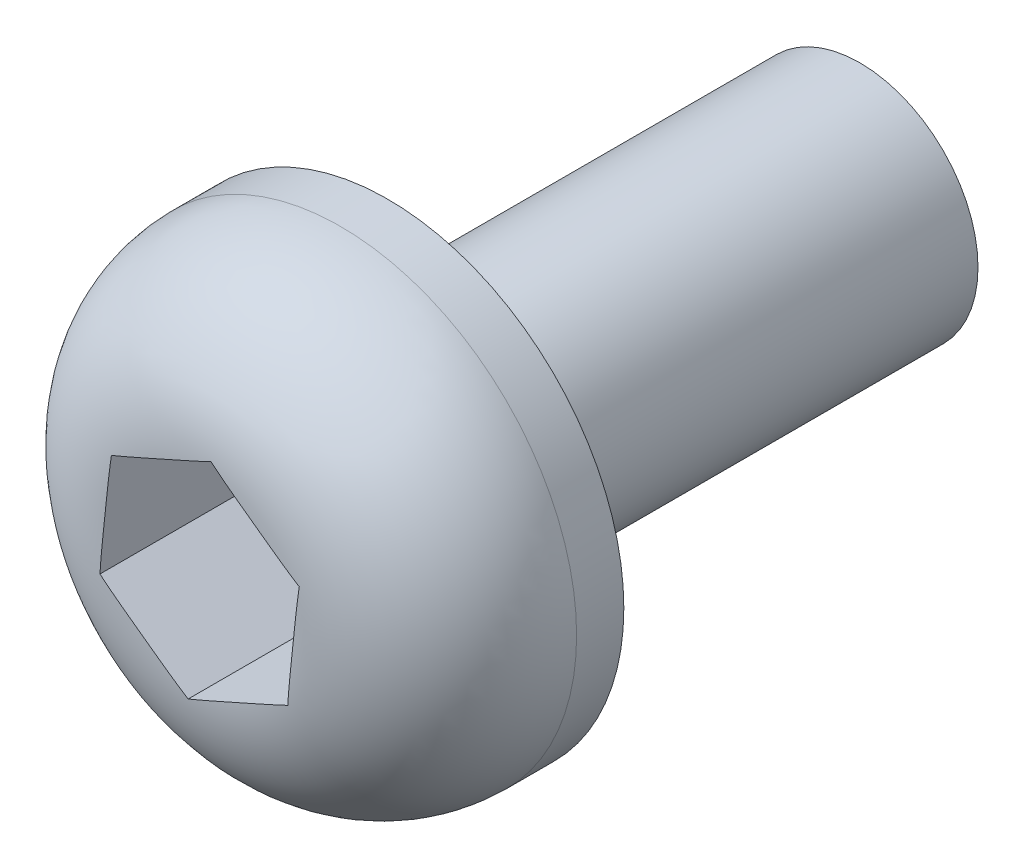
ISO-10303-21;
HEADER;
FILE_DESCRIPTION(('STEP AP214'),'2;1');
FILE_NAME('part.step','',(''),(''),'','','');
FILE_SCHEMA(('AUTOMOTIVE_DESIGN { 1 0 10303 214 1 1 1 1 }'));
ENDSEC;
DATA;
#1=APPLICATION_CONTEXT('core data for automotive mechanical design processes');
#2=APPLICATION_PROTOCOL_DEFINITION('international standard','automotive_design',2000,#1);
#3=PRODUCT_CONTEXT('',#1,'mechanical');
#4=PRODUCT('Part','Part','',(#3));
#5=PRODUCT_RELATED_PRODUCT_CATEGORY('part','',(#4));
#6=PRODUCT_DEFINITION_FORMATION('','',#4);
#7=PRODUCT_DEFINITION_CONTEXT('part definition',#1,'design');
#8=PRODUCT_DEFINITION('design','',#6,#7);
#9=PRODUCT_DEFINITION_SHAPE('','',#8);
#10=(LENGTH_UNIT() NAMED_UNIT(*) SI_UNIT(.MILLI.,.METRE.));
#11=(NAMED_UNIT(*) PLANE_ANGLE_UNIT() SI_UNIT($,.RADIAN.));
#12=(NAMED_UNIT(*) SI_UNIT($,.STERADIAN.) SOLID_ANGLE_UNIT());
#13=UNCERTAINTY_MEASURE_WITH_UNIT(LENGTH_MEASURE(1.E-05),#10,'distance_accuracy_value','');
#14=(GEOMETRIC_REPRESENTATION_CONTEXT(3) GLOBAL_UNCERTAINTY_ASSIGNED_CONTEXT((#13)) GLOBAL_UNIT_ASSIGNED_CONTEXT((#10,
#11,#12)) REPRESENTATION_CONTEXT('',''));
#15=CARTESIAN_POINT('',(0.,0.,0.));
#16=DIRECTION('',(0.,0.,1.));
#17=DIRECTION('',(1.,0.,0.));
#18=AXIS2_PLACEMENT_3D('',#15,#16,#17);
#19=CARTESIAN_POINT('',(0.,0.,10.));
#20=DIRECTION('',(0.,0.,-1.));
#21=DIRECTION('',(-1.,0.,0.));
#22=AXIS2_PLACEMENT_3D('',#19,#20,#21);
#23=CYLINDRICAL_SURFACE('',#22,2.5);
#24=CARTESIAN_POINT('',(0.,0.,10.));
#25=DIRECTION('',(0.,0.,1.));
#26=DIRECTION('',(1.,0.,0.));
#27=AXIS2_PLACEMENT_3D('',#24,#25,#26);
#28=CIRCLE('',#27,2.5);
#29=CARTESIAN_POINT('',(2.5,0.,10.));
#30=VERTEX_POINT('',#29);
#31=EDGE_CURVE('E156',#30,#30,#28,.T.);
#32=ORIENTED_EDGE('',*,*,#31,.F.);
#33=EDGE_LOOP('',(#32));
#34=FACE_BOUND('',#33,.T.);
#35=CARTESIAN_POINT('',(0.,0.,0.));
#36=DIRECTION('',(0.,0.,1.));
#37=DIRECTION('',(1.,0.,0.));
#38=AXIS2_PLACEMENT_3D('',#35,#36,#37);
#39=CIRCLE('',#38,2.5);
#40=CARTESIAN_POINT('',(2.5,0.,0.));
#41=VERTEX_POINT('',#40);
#42=EDGE_CURVE('E155',#41,#41,#39,.T.);
#43=ORIENTED_EDGE('',*,*,#42,.T.);
#44=EDGE_LOOP('',(#43));
#45=FACE_BOUND('',#44,.T.);
#46=ADVANCED_FACE('F39',(#34,#45),#23,.T.);
#47=CARTESIAN_POINT('',(0.,0.,0.));
#48=DIRECTION('',(0.,0.,1.));
#49=DIRECTION('',(1.,0.,0.));
#50=AXIS2_PLACEMENT_3D('',#47,#48,#49);
#51=PLANE('',#50);
#52=ORIENTED_EDGE('',*,*,#42,.F.);
#53=EDGE_LOOP('',(#52));
#54=FACE_BOUND('',#53,.T.);
#55=ADVANCED_FACE('F228',(#54),#51,.F.);
#56=CARTESIAN_POINT('',(0.,0.,14.));
#57=DIRECTION('',(0.,0.,-1.));
#58=DIRECTION('',(-1.,0.,0.));
#59=AXIS2_PLACEMENT_3D('',#56,#57,#58);
#60=CYLINDRICAL_SURFACE('',#59,5.);
#61=CARTESIAN_POINT('',(0.,0.,11.));
#62=DIRECTION('',(0.,0.,1.));
#63=DIRECTION('',(1.,0.,0.));
#64=AXIS2_PLACEMENT_3D('',#61,#62,#63);
#65=CIRCLE('',#64,5.);
#66=CARTESIAN_POINT('',(5.,0.,11.));
#67=VERTEX_POINT('',#66);
#68=EDGE_CURVE('E160',#67,#67,#65,.F.);
#69=ORIENTED_EDGE('',*,*,#68,.T.);
#70=EDGE_LOOP('',(#69));
#71=FACE_BOUND('',#70,.T.);
#72=CARTESIAN_POINT('',(0.,0.,10.));
#73=DIRECTION('',(0.,0.,1.));
#74=DIRECTION('',(1.,0.,0.));
#75=AXIS2_PLACEMENT_3D('',#72,#73,#74);
#76=CIRCLE('',#75,5.);
#77=CARTESIAN_POINT('',(5.,0.,10.));
#78=VERTEX_POINT('',#77);
#79=EDGE_CURVE('E137',#78,#78,#76,.T.);
#80=ORIENTED_EDGE('',*,*,#79,.T.);
#81=EDGE_LOOP('',(#80));
#82=FACE_BOUND('',#81,.T.);
#83=ADVANCED_FACE('F233',(#71,#82),#60,.T.);
#84=CARTESIAN_POINT('',(0.,0.,10.));
#85=DIRECTION('',(0.,0.,1.));
#86=DIRECTION('',(1.,0.,0.));
#87=AXIS2_PLACEMENT_3D('',#84,#85,#86);
#88=PLANE('',#87);
#89=ORIENTED_EDGE('',*,*,#31,.T.);
#90=EDGE_LOOP('',(#89));
#91=FACE_BOUND('',#90,.T.);
#92=ORIENTED_EDGE('',*,*,#79,.F.);
#93=EDGE_LOOP('',(#92));
#94=FACE_BOUND('',#93,.T.);
#95=ADVANCED_FACE('F192',(#91,#94),#88,.F.);
#96=CARTESIAN_POINT('',(0.,0.,11.));
#97=DIRECTION('',(0.,0.,1.));
#98=DIRECTION('',(1.,0.,0.));
#99=AXIS2_PLACEMENT_3D('',#96,#97,#98);
#100=DEGENERATE_TOROIDAL_SURFACE('',#99,2.,3.,.T.);
#101=CARTESIAN_POINT('',(0.242584408643206,2.2967350043414,13.9839911584187));
#102=CARTESIAN_POINT('',(0.154703364607828,2.25765305329027,13.9889633137289));
#103=CARTESIAN_POINT('',(0.0667727286874239,2.21854904802206,13.9923236986483));
#104=CARTESIAN_POINT('',(-0.109115845235615,2.14032889586108,13.9969215751443));
#105=CARTESIAN_POINT('',(-0.197073770320165,2.10121275471318,13.9981596148204));
#106=CARTESIAN_POINT('',(-0.3729708926868,2.02298880093767,13.999614716996));
#107=CARTESIAN_POINT('',(-0.460910089775323,1.98388098839614,13.9998320069029));
#108=CARTESIAN_POINT('',(-0.636795727842565,1.90566214185203,14.0000246574946));
#109=CARTESIAN_POINT('',(-0.724742168869094,1.86655110782817,14.));
#110=CARTESIAN_POINT('',(-0.900635050922154,1.78832903978046,14.));
#111=CARTESIAN_POINT('',(-0.988581491948683,1.7492180057566,14.0000246574946));
#112=CARTESIAN_POINT('',(-1.16446713001593,1.67099915921248,13.9998320069029));
#113=CARTESIAN_POINT('',(-1.25240632710445,1.63189134667096,13.999614716996));
#114=CARTESIAN_POINT('',(-1.42830344947108,1.55366739289545,13.9981596148204));
#115=CARTESIAN_POINT('',(-1.51626137455563,1.51455125174755,13.9969215751443));
#116=CARTESIAN_POINT('',(-1.69214994847867,1.43633109958657,13.9923236986483));
#117=CARTESIAN_POINT('',(-1.78008058439908,1.39722709431836,13.9889633137289));
#118=CARTESIAN_POINT('',(-1.86796162843445,1.35814514326723,13.9839911584187));
#119=B_SPLINE_CURVE_WITH_KNOTS('',3,(#101,#102,#103,#104,#105,#106,#107,#108,#109,#110,#111,
#112,#113,#114,#115,#116,#117,#118),.UNSPECIFIED.,.F.,.F.,(4,2,2,2,2,2,2,2,4),(0.,
0.288869834346141,0.577665056307041,0.866395936102187,1.15514851059254,1.44390108508289,
1.73263196487804,2.02142718683894,2.31029702118508),.UNSPECIFIED.);
#120=CARTESIAN_POINT('',(0.242384408643206,2.2966460614949,13.9840025089961));
#121=VERTEX_POINT('',#120);
#122=CARTESIAN_POINT('',(-1.86776162843445,1.35823408611373,13.9840025089971));
#123=VERTEX_POINT('',#122);
#124=EDGE_CURVE('E11',#121,#123,#119,.T.);
#125=ORIENTED_EDGE('',*,*,#124,.F.);
#126=CARTESIAN_POINT('',(2.11034603707766,0.938266535613536,13.9839896850081));
#127=CARTESIAN_POINT('',(2.03255764621417,0.994834163069987,13.9889622866953));
#128=CARTESIAN_POINT('',(1.95472535309896,1.05143371619287,13.9923229782809));
#129=CARTESIAN_POINT('',(1.79903659712337,1.16465039864926,13.9969212796634));
#130=CARTESIAN_POINT('',(1.72118014570051,1.22126751966541,13.9981594376807));
#131=CARTESIAN_POINT('',(1.56548382198476,1.33448970537365,13.9996146793568));
#132=CARTESIAN_POINT('',(1.48764394986328,1.39109476994109,13.9998319904746));
#133=CARTESIAN_POINT('',(1.33195779280956,1.50430956246452,14.000024659888));
#134=CARTESIAN_POINT('',(1.254111507835,1.56091929045127,14.));
#135=CARTESIAN_POINT('',(1.09841893788587,1.67413874642479,14.));
#136=CARTESIAN_POINT('',(1.0205726529113,1.73074847441154,14.000024659888));
#137=CARTESIAN_POINT('',(0.864886495857587,1.84396326693497,13.9998319904746));
#138=CARTESIAN_POINT('',(0.787046623736103,1.90056833150241,13.9996146793568));
#139=CARTESIAN_POINT('',(0.631350300020358,2.01379051721065,13.9981594376807));
#140=CARTESIAN_POINT('',(0.553493848597496,2.0704076382268,13.9969212796634));
#141=CARTESIAN_POINT('',(0.397805092621903,2.18362432068319,13.9923229782809));
#142=CARTESIAN_POINT('',(0.319972799506699,2.24022387380607,13.9889622866953));
#143=CARTESIAN_POINT('',(0.242184408643207,2.29679150126252,13.9839896850081));
#144=B_SPLINE_CURVE_WITH_KNOTS('',3,(#126,#127,#128,#129,#130,#131,#132,#133,#134,#135,#136,
#137,#138,#139,#140,#141,#142,#143),.UNSPECIFIED.,.F.,.F.,(4,2,2,2,2,2,2,2,4),(0.,
0.288876957701659,0.577679291323928,0.866417272664796,1.15517695212669,1.44393663158859,
1.73267461292945,2.02147694655172,2.31035390425338),.UNSPECIFIED.);
#145=CARTESIAN_POINT('',(2.11014603707766,0.938411975381164,13.9840025089971));
#146=VERTEX_POINT('',#145);
#147=EDGE_CURVE('E200',#146,#121,#144,.T.);
#148=ORIENTED_EDGE('',*,*,#147,.F.);
#149=CARTESIAN_POINT('',(1.86774052074941,-1.35843408611373,13.9839920803583));
#150=CARTESIAN_POINT('',(1.87783492551686,-1.2627873608063,13.9889639563617));
#151=CARTESIAN_POINT('',(1.88793502616267,-1.16708666578738,13.9923241493943));
#152=CARTESIAN_POINT('',(1.90813836323572,-0.975655563524609,13.9969217600313));
#153=CARTESIAN_POINT('',(1.91824159817938,-0.879925170338057,13.9981597256593));
#154=CARTESIAN_POINT('',(1.93844591708011,-0.688484765040082,13.9996147405474));
#155=CARTESIAN_POINT('',(1.94854700101497,-0.592774753139277,13.9998320171823));
#156=CARTESIAN_POINT('',(1.96875000088157,-0.401346845982427,14.000024655997));
#157=CARTESIAN_POINT('',(1.97885191681882,-0.305628950674356,14.));
#158=CARTESIAN_POINT('',(1.9990557486933,-0.114193160058213,14.));
#159=CARTESIAN_POINT('',(2.00915766463054,-0.018475264750141,14.000024655997));
#160=CARTESIAN_POINT('',(2.02936066449715,0.172952642406708,13.9998320171823));
#161=CARTESIAN_POINT('',(2.039461748432,0.268662654307513,13.9996147405474));
#162=CARTESIAN_POINT('',(2.05966606733274,0.460103059605488,13.9981597256593));
#163=CARTESIAN_POINT('',(2.06976930227639,0.55583345279204,13.9969217600313));
#164=CARTESIAN_POINT('',(2.08997263934944,0.747264555054807,13.9923241493943));
#165=CARTESIAN_POINT('',(2.10007273999526,0.842965250073737,13.9889639563617));
#166=CARTESIAN_POINT('',(2.11016714476271,0.938611975381164,13.9839920803583));
#167=B_SPLINE_CURVE_WITH_KNOTS('',3,(#149,#150,#151,#152,#153,#154,#155,#156,#157,#158,#159,
#160,#161,#162,#163,#164,#165,#166),.UNSPECIFIED.,.F.,.F.,(4,2,2,2,2,2,2,2,4),(0.,
0.288865376900354,0.577656148732329,0.866382584727764,1.15513071327492,1.44387884182207,
1.73260527781751,2.02139604964948,2.31026142654984),.UNSPECIFIED.);
#168=CARTESIAN_POINT('',(1.86776162843445,-1.35823408611373,13.984002508998));
#169=VERTEX_POINT('',#168);
#170=EDGE_CURVE('E175',#169,#146,#167,.T.);
#171=ORIENTED_EDGE('',*,*,#170,.F.);
#172=CARTESIAN_POINT('',(-0.242584408643206,-2.2967350043414,13.9839911584187));
#173=CARTESIAN_POINT('',(-0.154703364607828,-2.25765305329027,13.9889633137289));
#174=CARTESIAN_POINT('',(-0.0667727286874238,-2.21854904802206,13.9923236986483));
#175=CARTESIAN_POINT('',(0.109115845235615,-2.14032889586108,13.9969215751443));
#176=CARTESIAN_POINT('',(0.197073770320164,-2.10121275471318,13.9981596148204));
#177=CARTESIAN_POINT('',(0.3729708926868,-2.02298880093767,13.999614716996));
#178=CARTESIAN_POINT('',(0.460910089775323,-1.98388098839614,13.9998320069029));
#179=CARTESIAN_POINT('',(0.636795727842565,-1.90566214185203,14.0000246574946));
#180=CARTESIAN_POINT('',(0.724742168869094,-1.86655110782817,14.));
#181=CARTESIAN_POINT('',(0.900635050922153,-1.78832903978046,14.));
#182=CARTESIAN_POINT('',(0.988581491948683,-1.7492180057566,14.0000246574946));
#183=CARTESIAN_POINT('',(1.16446713001592,-1.67099915921248,13.9998320069029));
#184=CARTESIAN_POINT('',(1.25240632710445,-1.63189134667096,13.999614716996));
#185=CARTESIAN_POINT('',(1.42830344947108,-1.55366739289545,13.9981596148204));
#186=CARTESIAN_POINT('',(1.51626137455563,-1.51455125174755,13.9969215751443));
#187=CARTESIAN_POINT('',(1.69214994847867,-1.43633109958657,13.9923236986483));
#188=CARTESIAN_POINT('',(1.78008058439908,-1.39722709431836,13.9889633137289));
#189=CARTESIAN_POINT('',(1.86796162843445,-1.35814514326723,13.9839911584187));
#190=B_SPLINE_CURVE_WITH_KNOTS('',3,(#172,#173,#174,#175,#176,#177,#178,#179,#180,#181,#182,
#183,#184,#185,#186,#187,#188,#189),.UNSPECIFIED.,.F.,.F.,(4,2,2,2,2,2,2,2,4),(0.,
0.288869834346141,0.57766505630704,0.866395936102187,1.15514851059254,1.44390108508289,
1.73263196487804,2.02142718683894,2.31029702118508),.UNSPECIFIED.);
#191=CARTESIAN_POINT('',(-0.242384408643206,-2.2966460614949,13.9840025089971));
#192=VERTEX_POINT('',#191);
#193=EDGE_CURVE('E167',#192,#169,#190,.T.);
#194=ORIENTED_EDGE('',*,*,#193,.F.);
#195=CARTESIAN_POINT('',(-2.11034603707766,-0.938266535613535,13.9839896850081));
#196=CARTESIAN_POINT('',(-2.03255764621417,-0.994834163069986,13.9889622866953));
#197=CARTESIAN_POINT('',(-1.95472535309896,-1.05143371619287,13.9923229782809));
#198=CARTESIAN_POINT('',(-1.79903659712337,-1.16465039864926,13.9969212796634));
#199=CARTESIAN_POINT('',(-1.72118014570051,-1.22126751966541,13.9981594376807));
#200=CARTESIAN_POINT('',(-1.56548382198476,-1.33448970537365,13.9996146793568));
#201=CARTESIAN_POINT('',(-1.48764394986328,-1.39109476994109,13.9998319904746));
#202=CARTESIAN_POINT('',(-1.33195779280956,-1.50430956246451,14.000024659888));
#203=CARTESIAN_POINT('',(-1.254111507835,-1.56091929045127,14.));
#204=CARTESIAN_POINT('',(-1.09841893788587,-1.67413874642479,14.));
#205=CARTESIAN_POINT('',(-1.0205726529113,-1.73074847441154,14.000024659888));
#206=CARTESIAN_POINT('',(-0.864886495857587,-1.84396326693497,13.9998319904746));
#207=CARTESIAN_POINT('',(-0.787046623736103,-1.90056833150241,13.9996146793568));
#208=CARTESIAN_POINT('',(-0.631350300020358,-2.01379051721065,13.9981594376807));
#209=CARTESIAN_POINT('',(-0.553493848597495,-2.0704076382268,13.9969212796634));
#210=CARTESIAN_POINT('',(-0.397805092621903,-2.18362432068319,13.9923229782809));
#211=CARTESIAN_POINT('',(-0.319972799506699,-2.24022387380607,13.9889622866953));
#212=CARTESIAN_POINT('',(-0.242184408643206,-2.29679150126252,13.9839896850081));
#213=B_SPLINE_CURVE_WITH_KNOTS('',3,(#195,#196,#197,#198,#199,#200,#201,#202,#203,#204,#205,
#206,#207,#208,#209,#210,#211,#212),.UNSPECIFIED.,.F.,.F.,(4,2,2,2,2,2,2,2,4),(0.,
0.288876957701659,0.577679291323928,0.866417272664796,1.15517695212669,1.44393663158859,
1.73267461292946,2.02147694655172,2.31035390425338),.UNSPECIFIED.);
#214=CARTESIAN_POINT('',(-2.11014603707766,-0.938411975381162,13.9840025089981));
#215=VERTEX_POINT('',#214);
#216=EDGE_CURVE('E61',#215,#192,#213,.T.);
#217=ORIENTED_EDGE('',*,*,#216,.F.);
#218=CARTESIAN_POINT('',(-1.86774052074941,1.35843408611373,13.9839920803583));
#219=CARTESIAN_POINT('',(-1.87783492551686,1.2627873608063,13.9889639563617));
#220=CARTESIAN_POINT('',(-1.88793502616267,1.16708666578738,13.9923241493943));
#221=CARTESIAN_POINT('',(-1.90813836323572,0.975655563524609,13.9969217600313));
#222=CARTESIAN_POINT('',(-1.91824159817938,0.879925170338057,13.9981597256593));
#223=CARTESIAN_POINT('',(-1.93844591708012,0.688484765040082,13.9996147405474));
#224=CARTESIAN_POINT('',(-1.94854700101497,0.592774753139277,13.9998320171823));
#225=CARTESIAN_POINT('',(-1.96875000088157,0.401346845982428,14.000024655997));
#226=CARTESIAN_POINT('',(-1.97885191681882,0.305628950674356,14.));
#227=CARTESIAN_POINT('',(-1.9990557486933,0.114193160058213,14.));
#228=CARTESIAN_POINT('',(-2.00915766463054,0.0184752647501418,14.000024655997));
#229=CARTESIAN_POINT('',(-2.02936066449715,-0.172952642406707,13.9998320171823));
#230=CARTESIAN_POINT('',(-2.039461748432,-0.268662654307512,13.9996147405474));
#231=CARTESIAN_POINT('',(-2.05966606733274,-0.460103059605487,13.9981597256593));
#232=CARTESIAN_POINT('',(-2.06976930227639,-0.555833452792039,13.9969217600313));
#233=CARTESIAN_POINT('',(-2.08997263934944,-0.747264555054806,13.9923241493943));
#234=CARTESIAN_POINT('',(-2.10007273999526,-0.842965250073735,13.9889639563617));
#235=CARTESIAN_POINT('',(-2.11016714476271,-0.938611975381162,13.9839920803583));
#236=B_SPLINE_CURVE_WITH_KNOTS('',3,(#218,#219,#220,#221,#222,#223,#224,#225,#226,#227,#228,
#229,#230,#231,#232,#233,#234,#235),.UNSPECIFIED.,.F.,.F.,(4,2,2,2,2,2,2,2,4),(0.,
0.288865376900354,0.577656148732329,0.866382584727764,1.15513071327492,1.44387884182207,
1.73260527781751,2.02139604964948,2.31026142654984),.UNSPECIFIED.);
#237=EDGE_CURVE('E54',#123,#215,#236,.T.);
#238=ORIENTED_EDGE('',*,*,#237,.F.);
#239=EDGE_LOOP('',(#125,#148,#171,#194,#217,#238));
#240=FACE_BOUND('',#239,.T.);
#241=ORIENTED_EDGE('',*,*,#68,.F.);
#242=EDGE_LOOP('',(#241));
#243=FACE_BOUND('',#242,.T.);
#244=ADVANCED_FACE('F41',(#240,#243),#100,.T.);
#245=CARTESIAN_POINT('',(-2.11014603707766,-0.938411975381162,11.));
#246=DIRECTION('',(-0.588132611430217,-0.808764509219015,0.));
#247=DIRECTION('',(0.808764509219015,-0.588132611430217,0.));
#248=AXIS2_PLACEMENT_3D('',#245,#246,#247);
#249=PLANE('',#248);
#250=DIRECTION('',(0.,0.,1.));
#251=VECTOR('',#250,1.);
#252=CARTESIAN_POINT('',(-2.11014603707766,-0.938411975381162,11.));
#253=LINE('',#252,#251);
#254=CARTESIAN_POINT('',(-2.11014603707766,-0.938411975381162,11.));
#255=VERTEX_POINT('',#254);
#256=EDGE_CURVE('E134',#255,#215,#253,.T.);
#257=ORIENTED_EDGE('',*,*,#256,.T.);
#258=ORIENTED_EDGE('',*,*,#216,.T.);
#259=DIRECTION('',(0.,0.,1.));
#260=VECTOR('',#259,1.);
#261=CARTESIAN_POINT('',(-0.242384408643206,-2.2966460614949,11.));
#262=LINE('',#261,#260);
#263=CARTESIAN_POINT('',(-0.242384408643206,-2.2966460614949,11.));
#264=VERTEX_POINT('',#263);
#265=EDGE_CURVE('E95',#264,#192,#262,.T.);
#266=ORIENTED_EDGE('',*,*,#265,.F.);
#267=DIRECTION('',(0.808764509219015,-0.588132611430217,0.));
#268=VECTOR('',#267,1.);
#269=CARTESIAN_POINT('',(-2.11014603707766,-0.938411975381162,11.));
#270=LINE('',#269,#268);
#271=EDGE_CURVE('E100',#255,#264,#270,.T.);
#272=ORIENTED_EDGE('',*,*,#271,.F.);
#273=EDGE_LOOP('',(#257,#258,#266,#272));
#274=FACE_BOUND('',#273,.T.);
#275=ADVANCED_FACE('F98',(#274),#249,.F.);
#276=CARTESIAN_POINT('',(-1.86776162843445,1.35823408611373,11.));
#277=DIRECTION('',(-0.994476916378029,0.104955527683142,0.));
#278=DIRECTION('',(-0.104955527683142,-0.994476916378029,0.));
#279=AXIS2_PLACEMENT_3D('',#276,#277,#278);
#280=PLANE('',#279);
#281=DIRECTION('',(0.,0.,1.));
#282=VECTOR('',#281,1.);
#283=CARTESIAN_POINT('',(-1.86776162843445,1.35823408611373,11.));
#284=LINE('',#283,#282);
#285=CARTESIAN_POINT('',(-1.86776162843445,1.35823408611373,11.));
#286=VERTEX_POINT('',#285);
#287=EDGE_CURVE('E138',#286,#123,#284,.T.);
#288=ORIENTED_EDGE('',*,*,#287,.T.);
#289=ORIENTED_EDGE('',*,*,#237,.T.);
#290=ORIENTED_EDGE('',*,*,#256,.F.);
#291=DIRECTION('',(-0.104955527683142,-0.994476916378029,0.));
#292=VECTOR('',#291,1.);
#293=CARTESIAN_POINT('',(-1.86776162843445,1.35823408611373,11.));
#294=LINE('',#293,#292);
#295=EDGE_CURVE('E105',#286,#255,#294,.T.);
#296=ORIENTED_EDGE('',*,*,#295,.F.);
#297=EDGE_LOOP('',(#288,#289,#290,#296));
#298=FACE_BOUND('',#297,.T.);
#299=ADVANCED_FACE('F191',(#298),#280,.F.);
#300=CARTESIAN_POINT('',(0.242384408643206,2.2966460614949,11.));
#301=DIRECTION('',(-0.406344304947812,0.913720036902157,0.));
#302=DIRECTION('',(-0.913720036902157,-0.406344304947812,0.));
#303=AXIS2_PLACEMENT_3D('',#300,#301,#302);
#304=PLANE('',#303);
#305=DIRECTION('',(0.,0.,1.));
#306=VECTOR('',#305,1.);
#307=CARTESIAN_POINT('',(0.242384408643206,2.2966460614949,11.));
#308=LINE('',#307,#306);
#309=CARTESIAN_POINT('',(0.242384408643206,2.2966460614949,11.));
#310=VERTEX_POINT('',#309);
#311=EDGE_CURVE('E142',#310,#121,#308,.T.);
#312=ORIENTED_EDGE('',*,*,#311,.T.);
#313=ORIENTED_EDGE('',*,*,#124,.T.);
#314=ORIENTED_EDGE('',*,*,#287,.F.);
#315=DIRECTION('',(-0.913720036902157,-0.406344304947812,0.));
#316=VECTOR('',#315,1.);
#317=CARTESIAN_POINT('',(0.242384408643206,2.2966460614949,11.));
#318=LINE('',#317,#316);
#319=EDGE_CURVE('E129',#310,#286,#318,.T.);
#320=ORIENTED_EDGE('',*,*,#319,.F.);
#321=EDGE_LOOP('',(#312,#313,#314,#320));
#322=FACE_BOUND('',#321,.T.);
#323=ADVANCED_FACE('F215',(#322),#304,.F.);
#324=CARTESIAN_POINT('',(2.11014603707766,0.938411975381164,11.));
#325=DIRECTION('',(0.588132611430217,0.808764509219015,0.));
#326=DIRECTION('',(-0.808764509219015,0.588132611430217,0.));
#327=AXIS2_PLACEMENT_3D('',#324,#325,#326);
#328=PLANE('',#327);
#329=ORIENTED_EDGE('',*,*,#147,.T.);
#330=ORIENTED_EDGE('',*,*,#311,.F.);
#331=DIRECTION('',(-0.808764509219015,0.588132611430217,0.));
#332=VECTOR('',#331,1.);
#333=CARTESIAN_POINT('',(2.11014603707766,0.938411975381164,11.));
#334=LINE('',#333,#332);
#335=CARTESIAN_POINT('',(2.11014603707766,0.938411975381164,11.));
#336=VERTEX_POINT('',#335);
#337=EDGE_CURVE('E125',#336,#310,#334,.T.);
#338=ORIENTED_EDGE('',*,*,#337,.F.);
#339=DIRECTION('',(0.,0.,1.));
#340=VECTOR('',#339,1.);
#341=CARTESIAN_POINT('',(2.11014603707766,0.938411975381164,11.));
#342=LINE('',#341,#340);
#343=EDGE_CURVE('E146',#336,#146,#342,.T.);
#344=ORIENTED_EDGE('',*,*,#343,.T.);
#345=EDGE_LOOP('',(#329,#330,#338,#344));
#346=FACE_BOUND('',#345,.T.);
#347=ADVANCED_FACE('F212',(#346),#328,.F.);
#348=CARTESIAN_POINT('',(1.86776162843445,-1.35823408611373,11.));
#349=DIRECTION('',(0.994476916378029,-0.104955527683142,0.));
#350=DIRECTION('',(0.104955527683142,0.994476916378029,0.));
#351=AXIS2_PLACEMENT_3D('',#348,#349,#350);
#352=PLANE('',#351);
#353=ORIENTED_EDGE('',*,*,#170,.T.);
#354=ORIENTED_EDGE('',*,*,#343,.F.);
#355=DIRECTION('',(0.104955527683142,0.994476916378029,0.));
#356=VECTOR('',#355,1.);
#357=CARTESIAN_POINT('',(1.86776162843445,-1.35823408611373,11.));
#358=LINE('',#357,#356);
#359=CARTESIAN_POINT('',(1.86776162843445,-1.35823408611373,11.));
#360=VERTEX_POINT('',#359);
#361=EDGE_CURVE('E115',#360,#336,#358,.T.);
#362=ORIENTED_EDGE('',*,*,#361,.F.);
#363=DIRECTION('',(0.,0.,1.));
#364=VECTOR('',#363,1.);
#365=CARTESIAN_POINT('',(1.86776162843445,-1.35823408611373,11.));
#366=LINE('',#365,#364);
#367=EDGE_CURVE('E104',#360,#169,#366,.T.);
#368=ORIENTED_EDGE('',*,*,#367,.T.);
#369=EDGE_LOOP('',(#353,#354,#362,#368));
#370=FACE_BOUND('',#369,.T.);
#371=ADVANCED_FACE('F185',(#370),#352,.F.);
#372=CARTESIAN_POINT('',(-0.242384408643206,-2.2966460614949,11.));
#373=DIRECTION('',(0.406344304947812,-0.913720036902157,0.));
#374=DIRECTION('',(0.913720036902157,0.406344304947812,0.));
#375=AXIS2_PLACEMENT_3D('',#372,#373,#374);
#376=PLANE('',#375);
#377=ORIENTED_EDGE('',*,*,#265,.T.);
#378=ORIENTED_EDGE('',*,*,#193,.T.);
#379=ORIENTED_EDGE('',*,*,#367,.F.);
#380=DIRECTION('',(0.913720036902157,0.406344304947812,0.));
#381=VECTOR('',#380,1.);
#382=CARTESIAN_POINT('',(-0.242384408643206,-2.2966460614949,11.));
#383=LINE('',#382,#381);
#384=EDGE_CURVE('E108',#264,#360,#383,.T.);
#385=ORIENTED_EDGE('',*,*,#384,.F.);
#386=EDGE_LOOP('',(#377,#378,#379,#385));
#387=FACE_BOUND('',#386,.T.);
#388=ADVANCED_FACE('F109',(#387),#376,.F.);
#389=CARTESIAN_POINT('',(0.,0.,11.));
#390=DIRECTION('',(0.,0.,1.));
#391=DIRECTION('',(1.,0.,0.));
#392=AXIS2_PLACEMENT_3D('',#389,#390,#391);
#393=PLANE('',#392);
#394=ORIENTED_EDGE('',*,*,#271,.T.);
#395=ORIENTED_EDGE('',*,*,#384,.T.);
#396=ORIENTED_EDGE('',*,*,#361,.T.);
#397=ORIENTED_EDGE('',*,*,#337,.T.);
#398=ORIENTED_EDGE('',*,*,#319,.T.);
#399=ORIENTED_EDGE('',*,*,#295,.T.);
#400=EDGE_LOOP('',(#394,#395,#396,#397,#398,#399));
#401=FACE_BOUND('',#400,.T.);
#402=ADVANCED_FACE('F117',(#401),#393,.T.);
#403=CLOSED_SHELL('',(#46,#55,#83,#95,#244,#275,#299,#323,#347,#371,#388,#402));
#404=MANIFOLD_SOLID_BREP('B2',#403);
#405=ADVANCED_BREP_SHAPE_REPRESENTATION('',(#18,#404),#14);
#406=SHAPE_DEFINITION_REPRESENTATION(#9,#405);
ENDSEC;
END-ISO-10303-21;
